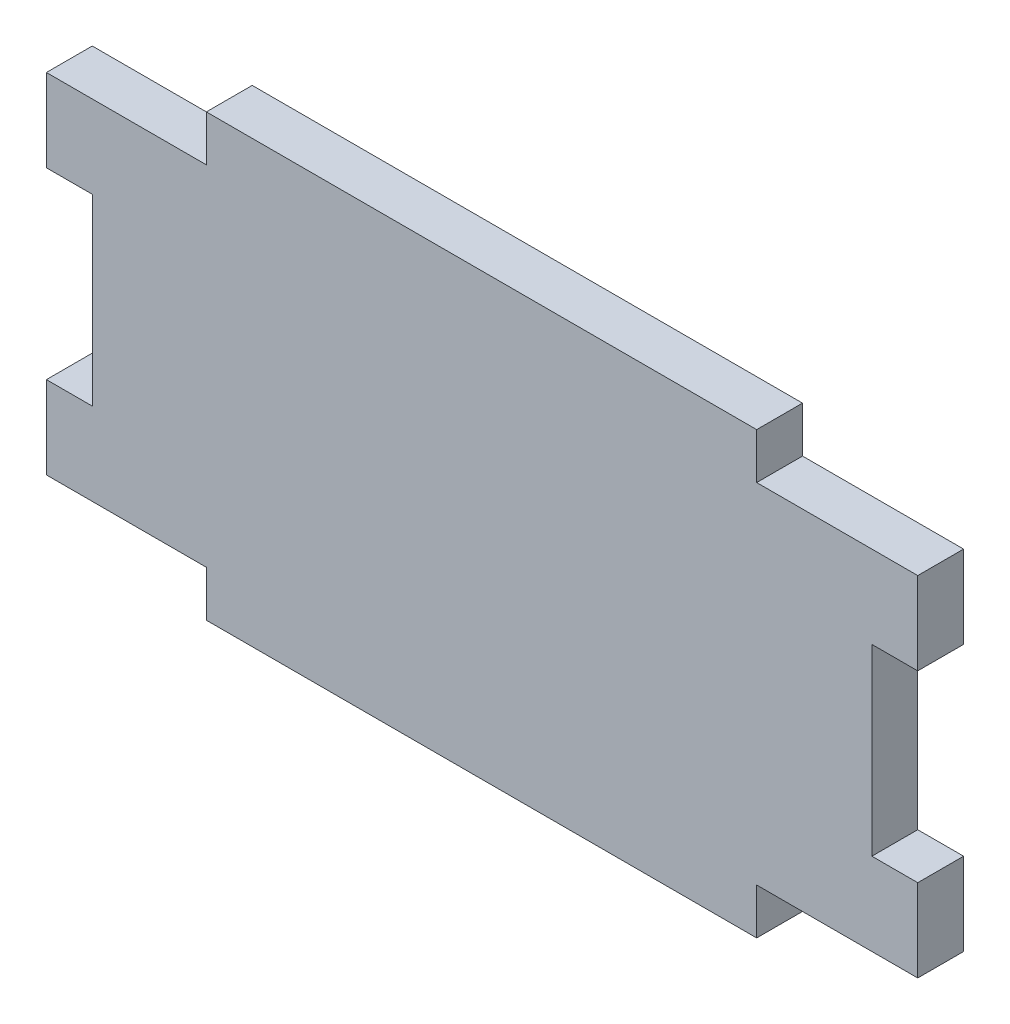
ISO-10303-21;
HEADER;
FILE_DESCRIPTION(('STEP AP214'),'2;1');
FILE_NAME('part.step','',(''),(''),'','','');
FILE_SCHEMA(('AUTOMOTIVE_DESIGN { 1 0 10303 214 1 1 1 1 }'));
ENDSEC;
DATA;
#1=APPLICATION_CONTEXT('core data for automotive mechanical design processes');
#2=APPLICATION_PROTOCOL_DEFINITION('international standard','automotive_design',2000,#1);
#3=PRODUCT_CONTEXT('',#1,'mechanical');
#4=PRODUCT('Part','Part','',(#3));
#5=PRODUCT_RELATED_PRODUCT_CATEGORY('part','',(#4));
#6=PRODUCT_DEFINITION_FORMATION('','',#4);
#7=PRODUCT_DEFINITION_CONTEXT('part definition',#1,'design');
#8=PRODUCT_DEFINITION('design','',#6,#7);
#9=PRODUCT_DEFINITION_SHAPE('','',#8);
#10=(LENGTH_UNIT() NAMED_UNIT(*) SI_UNIT(.MILLI.,.METRE.));
#11=(NAMED_UNIT(*) PLANE_ANGLE_UNIT() SI_UNIT($,.RADIAN.));
#12=(NAMED_UNIT(*) SI_UNIT($,.STERADIAN.) SOLID_ANGLE_UNIT());
#13=UNCERTAINTY_MEASURE_WITH_UNIT(LENGTH_MEASURE(1.E-05),#10,'distance_accuracy_value','');
#14=(GEOMETRIC_REPRESENTATION_CONTEXT(3) GLOBAL_UNCERTAINTY_ASSIGNED_CONTEXT((#13)) GLOBAL_UNIT_ASSIGNED_CONTEXT((#10,
#11,#12)) REPRESENTATION_CONTEXT('',''));
#15=CARTESIAN_POINT('',(0.,0.,0.));
#16=DIRECTION('',(0.,0.,1.));
#17=DIRECTION('',(1.,0.,0.));
#18=AXIS2_PLACEMENT_3D('',#15,#16,#17);
#19=CARTESIAN_POINT('',(-67.2746171850988,0.,5.));
#20=DIRECTION('',(1.,0.,0.));
#21=DIRECTION('',(0.,0.,-1.));
#22=AXIS2_PLACEMENT_3D('',#19,#20,#21);
#23=PLANE('',#22);
#24=DIRECTION('',(0.,-1.,0.));
#25=VECTOR('',#24,1.);
#26=CARTESIAN_POINT('',(-67.2746171850988,0.,0.));
#27=LINE('',#26,#25);
#28=CARTESIAN_POINT('',(-67.2746171850988,-84.2681131457359,0.));
#29=VERTEX_POINT('',#28);
#30=CARTESIAN_POINT('',(-67.2746171850988,-104.268113145736,0.));
#31=VERTEX_POINT('',#30);
#32=EDGE_CURVE('E199',#29,#31,#27,.T.);
#33=ORIENTED_EDGE('',*,*,#32,.F.);
#34=DIRECTION('',(0.,0.,-1.));
#35=VECTOR('',#34,1.);
#36=CARTESIAN_POINT('',(-67.2746171850988,-84.2681131457359,5.));
#37=LINE('',#36,#35);
#38=CARTESIAN_POINT('',(-67.2746171850988,-84.2681131457359,5.));
#39=VERTEX_POINT('',#38);
#40=EDGE_CURVE('E11',#39,#29,#37,.T.);
#41=ORIENTED_EDGE('',*,*,#40,.F.);
#42=DIRECTION('',(0.,-1.,0.));
#43=VECTOR('',#42,1.);
#44=CARTESIAN_POINT('',(-67.2746171850988,0.,5.));
#45=LINE('',#44,#43);
#46=CARTESIAN_POINT('',(-67.2746171850988,-104.268113145736,5.));
#47=VERTEX_POINT('',#46);
#48=EDGE_CURVE('E247',#39,#47,#45,.T.);
#49=ORIENTED_EDGE('',*,*,#48,.T.);
#50=DIRECTION('',(0.,0.,-1.));
#51=VECTOR('',#50,1.);
#52=CARTESIAN_POINT('',(-67.2746171850988,-104.268113145736,5.));
#53=LINE('',#52,#51);
#54=EDGE_CURVE('E119',#47,#31,#53,.T.);
#55=ORIENTED_EDGE('',*,*,#54,.T.);
#56=EDGE_LOOP('',(#33,#41,#49,#55));
#57=FACE_BOUND('',#56,.T.);
#58=ADVANCED_FACE('F33',(#57),#23,.T.);
#59=CARTESIAN_POINT('',(0.,-84.2681131457359,5.));
#60=DIRECTION('',(0.,-1.,0.));
#61=DIRECTION('',(0.,0.,-1.));
#62=AXIS2_PLACEMENT_3D('',#59,#60,#61);
#63=PLANE('',#62);
#64=DIRECTION('',(-1.,0.,0.));
#65=VECTOR('',#64,1.);
#66=CARTESIAN_POINT('',(0.,-84.2681131457359,0.));
#67=LINE('',#66,#65);
#68=CARTESIAN_POINT('',(-62.2746171850988,-84.2681131457359,0.));
#69=VERTEX_POINT('',#68);
#70=EDGE_CURVE('E202',#69,#29,#67,.T.);
#71=ORIENTED_EDGE('',*,*,#70,.F.);
#72=DIRECTION('',(0.,0.,-1.));
#73=VECTOR('',#72,1.);
#74=CARTESIAN_POINT('',(-62.2746171850988,-84.2681131457359,5.));
#75=LINE('',#74,#73);
#76=CARTESIAN_POINT('',(-62.2746171850988,-84.2681131457359,5.));
#77=VERTEX_POINT('',#76);
#78=EDGE_CURVE('E41',#77,#69,#75,.T.);
#79=ORIENTED_EDGE('',*,*,#78,.F.);
#80=DIRECTION('',(-1.,0.,0.));
#81=VECTOR('',#80,1.);
#82=CARTESIAN_POINT('',(0.,-84.2681131457359,5.));
#83=LINE('',#82,#81);
#84=EDGE_CURVE('E305',#77,#39,#83,.T.);
#85=ORIENTED_EDGE('',*,*,#84,.T.);
#86=ORIENTED_EDGE('',*,*,#40,.T.);
#87=EDGE_LOOP('',(#71,#79,#85,#86));
#88=FACE_BOUND('',#87,.T.);
#89=ADVANCED_FACE('F293',(#88),#63,.T.);
#90=CARTESIAN_POINT('',(-62.2746171850988,0.,5.));
#91=DIRECTION('',(1.,0.,0.));
#92=DIRECTION('',(0.,0.,-1.));
#93=AXIS2_PLACEMENT_3D('',#90,#91,#92);
#94=PLANE('',#93);
#95=DIRECTION('',(0.,-1.,0.));
#96=VECTOR('',#95,1.);
#97=CARTESIAN_POINT('',(-62.2746171850988,0.,0.));
#98=LINE('',#97,#96);
#99=CARTESIAN_POINT('',(-62.2746171850988,-75.2681131457359,0.));
#100=VERTEX_POINT('',#99);
#101=EDGE_CURVE('E205',#100,#69,#98,.T.);
#102=ORIENTED_EDGE('',*,*,#101,.F.);
#103=DIRECTION('',(0.,0.,-1.));
#104=VECTOR('',#103,1.);
#105=CARTESIAN_POINT('',(-62.2746171850988,-75.2681131457359,5.));
#106=LINE('',#105,#104);
#107=CARTESIAN_POINT('',(-62.2746171850988,-75.2681131457359,5.));
#108=VERTEX_POINT('',#107);
#109=EDGE_CURVE('E282',#108,#100,#106,.T.);
#110=ORIENTED_EDGE('',*,*,#109,.F.);
#111=DIRECTION('',(0.,-1.,0.));
#112=VECTOR('',#111,1.);
#113=CARTESIAN_POINT('',(-62.2746171850988,0.,5.));
#114=LINE('',#113,#112);
#115=EDGE_CURVE('E289',#108,#77,#114,.T.);
#116=ORIENTED_EDGE('',*,*,#115,.T.);
#117=ORIENTED_EDGE('',*,*,#78,.T.);
#118=EDGE_LOOP('',(#102,#110,#116,#117));
#119=FACE_BOUND('',#118,.T.);
#120=ADVANCED_FACE('F287',(#119),#94,.T.);
#121=CARTESIAN_POINT('',(0.,-75.2681131457359,5.));
#122=DIRECTION('',(0.,1.,0.));
#123=DIRECTION('',(0.,0.,1.));
#124=AXIS2_PLACEMENT_3D('',#121,#122,#123);
#125=PLANE('',#124);
#126=DIRECTION('',(1.,0.,0.));
#127=VECTOR('',#126,1.);
#128=CARTESIAN_POINT('',(0.,-75.2681131457359,0.));
#129=LINE('',#128,#127);
#130=CARTESIAN_POINT('',(-79.8357424721595,-75.2681131457359,0.));
#131=VERTEX_POINT('',#130);
#132=EDGE_CURVE('E208',#131,#100,#129,.T.);
#133=ORIENTED_EDGE('',*,*,#132,.F.);
#134=DIRECTION('',(0.,0.,-1.));
#135=VECTOR('',#134,1.);
#136=CARTESIAN_POINT('',(-79.8357424721595,-75.2681131457359,5.));
#137=LINE('',#136,#135);
#138=CARTESIAN_POINT('',(-79.8357424721595,-75.2681131457359,5.));
#139=VERTEX_POINT('',#138);
#140=EDGE_CURVE('E280',#139,#131,#137,.T.);
#141=ORIENTED_EDGE('',*,*,#140,.F.);
#142=DIRECTION('',(1.,0.,0.));
#143=VECTOR('',#142,1.);
#144=CARTESIAN_POINT('',(0.,-75.2681131457359,5.));
#145=LINE('',#144,#143);
#146=EDGE_CURVE('E302',#139,#108,#145,.T.);
#147=ORIENTED_EDGE('',*,*,#146,.T.);
#148=ORIENTED_EDGE('',*,*,#109,.T.);
#149=EDGE_LOOP('',(#133,#141,#147,#148));
#150=FACE_BOUND('',#149,.T.);
#151=ADVANCED_FACE('F299',(#150),#125,.T.);
#152=CARTESIAN_POINT('',(-79.8357424721595,0.,5.));
#153=DIRECTION('',(1.,0.,0.));
#154=DIRECTION('',(0.,0.,-1.));
#155=AXIS2_PLACEMENT_3D('',#152,#153,#154);
#156=PLANE('',#155);
#157=DIRECTION('',(0.,-1.,0.));
#158=VECTOR('',#157,1.);
#159=CARTESIAN_POINT('',(-79.8357424721595,0.,0.));
#160=LINE('',#159,#158);
#161=CARTESIAN_POINT('',(-79.8357424721595,-70.2681131457359,0.));
#162=VERTEX_POINT('',#161);
#163=EDGE_CURVE('E211',#162,#131,#160,.T.);
#164=ORIENTED_EDGE('',*,*,#163,.F.);
#165=DIRECTION('',(0.,0.,-1.));
#166=VECTOR('',#165,1.);
#167=CARTESIAN_POINT('',(-79.8357424721595,-70.2681131457359,5.));
#168=LINE('',#167,#166);
#169=CARTESIAN_POINT('',(-79.8357424721595,-70.2681131457359,5.));
#170=VERTEX_POINT('',#169);
#171=EDGE_CURVE('E278',#170,#162,#168,.T.);
#172=ORIENTED_EDGE('',*,*,#171,.F.);
#173=DIRECTION('',(0.,-1.,0.));
#174=VECTOR('',#173,1.);
#175=CARTESIAN_POINT('',(-79.8357424721595,0.,5.));
#176=LINE('',#175,#174);
#177=EDGE_CURVE('E307',#170,#139,#176,.T.);
#178=ORIENTED_EDGE('',*,*,#177,.T.);
#179=ORIENTED_EDGE('',*,*,#140,.T.);
#180=EDGE_LOOP('',(#164,#172,#178,#179));
#181=FACE_BOUND('',#180,.T.);
#182=ADVANCED_FACE('F348',(#181),#156,.T.);
#183=CARTESIAN_POINT('',(0.,-70.2681131457359,5.));
#184=DIRECTION('',(0.,1.,0.));
#185=DIRECTION('',(0.,0.,1.));
#186=AXIS2_PLACEMENT_3D('',#183,#184,#185);
#187=PLANE('',#186);
#188=DIRECTION('',(1.,0.,0.));
#189=VECTOR('',#188,1.);
#190=CARTESIAN_POINT('',(0.,-70.2681131457359,0.));
#191=LINE('',#190,#189);
#192=CARTESIAN_POINT('',(-139.835742472159,-70.2681131457359,0.));
#193=VERTEX_POINT('',#192);
#194=EDGE_CURVE('E215',#193,#162,#191,.T.);
#195=ORIENTED_EDGE('',*,*,#194,.F.);
#196=DIRECTION('',(0.,0.,-1.));
#197=VECTOR('',#196,1.);
#198=CARTESIAN_POINT('',(-139.835742472159,-70.2681131457359,5.));
#199=LINE('',#198,#197);
#200=CARTESIAN_POINT('',(-139.835742472159,-70.2681131457359,5.));
#201=VERTEX_POINT('',#200);
#202=EDGE_CURVE('E276',#201,#193,#199,.T.);
#203=ORIENTED_EDGE('',*,*,#202,.F.);
#204=DIRECTION('',(1.,0.,0.));
#205=VECTOR('',#204,1.);
#206=CARTESIAN_POINT('',(0.,-70.2681131457359,5.));
#207=LINE('',#206,#205);
#208=EDGE_CURVE('E314',#201,#170,#207,.T.);
#209=ORIENTED_EDGE('',*,*,#208,.T.);
#210=ORIENTED_EDGE('',*,*,#171,.T.);
#211=EDGE_LOOP('',(#195,#203,#209,#210));
#212=FACE_BOUND('',#211,.T.);
#213=ADVANCED_FACE('F351',(#212),#187,.T.);
#214=CARTESIAN_POINT('',(-139.835742472159,0.,5.));
#215=DIRECTION('',(1.,0.,0.));
#216=DIRECTION('',(0.,0.,-1.));
#217=AXIS2_PLACEMENT_3D('',#214,#215,#216);
#218=PLANE('',#217);
#219=DIRECTION('',(0.,-1.,0.));
#220=VECTOR('',#219,1.);
#221=CARTESIAN_POINT('',(-139.835742472159,0.,0.));
#222=LINE('',#221,#220);
#223=CARTESIAN_POINT('',(-139.835742472159,-75.2681131457359,0.));
#224=VERTEX_POINT('',#223);
#225=EDGE_CURVE('E218',#193,#224,#222,.T.);
#226=ORIENTED_EDGE('',*,*,#225,.T.);
#227=DIRECTION('',(0.,0.,-1.));
#228=VECTOR('',#227,1.);
#229=CARTESIAN_POINT('',(-139.835742472159,-75.2681131457359,5.));
#230=LINE('',#229,#228);
#231=CARTESIAN_POINT('',(-139.835742472159,-75.2681131457359,5.));
#232=VERTEX_POINT('',#231);
#233=EDGE_CURVE('E274',#232,#224,#230,.T.);
#234=ORIENTED_EDGE('',*,*,#233,.F.);
#235=DIRECTION('',(0.,-1.,0.));
#236=VECTOR('',#235,1.);
#237=CARTESIAN_POINT('',(-139.835742472159,0.,5.));
#238=LINE('',#237,#236);
#239=EDGE_CURVE('E317',#201,#232,#238,.T.);
#240=ORIENTED_EDGE('',*,*,#239,.F.);
#241=ORIENTED_EDGE('',*,*,#202,.T.);
#242=EDGE_LOOP('',(#226,#234,#240,#241));
#243=FACE_BOUND('',#242,.T.);
#244=ADVANCED_FACE('F355',(#243),#218,.F.);
#245=CARTESIAN_POINT('',(-157.274617185099,-75.2681131457359,0.));
#246=VERTEX_POINT('',#245);
#247=EDGE_CURVE('E212',#246,#224,#129,.T.);
#248=ORIENTED_EDGE('',*,*,#247,.F.);
#249=DIRECTION('',(0.,0.,-1.));
#250=VECTOR('',#249,1.);
#251=CARTESIAN_POINT('',(-157.274617185099,-75.2681131457359,5.));
#252=LINE('',#251,#250);
#253=CARTESIAN_POINT('',(-157.274617185099,-75.2681131457359,5.));
#254=VERTEX_POINT('',#253);
#255=EDGE_CURVE('E272',#254,#246,#252,.T.);
#256=ORIENTED_EDGE('',*,*,#255,.F.);
#257=EDGE_CURVE('E309',#254,#232,#145,.T.);
#258=ORIENTED_EDGE('',*,*,#257,.T.);
#259=ORIENTED_EDGE('',*,*,#233,.T.);
#260=EDGE_LOOP('',(#248,#256,#258,#259));
#261=FACE_BOUND('',#260,.T.);
#262=ADVANCED_FACE('F359',(#261),#125,.T.);
#263=CARTESIAN_POINT('',(-157.274617185099,0.,5.));
#264=DIRECTION('',(1.,0.,0.));
#265=DIRECTION('',(0.,0.,-1.));
#266=AXIS2_PLACEMENT_3D('',#263,#264,#265);
#267=PLANE('',#266);
#268=DIRECTION('',(0.,-1.,0.));
#269=VECTOR('',#268,1.);
#270=CARTESIAN_POINT('',(-157.274617185099,0.,0.));
#271=LINE('',#270,#269);
#272=CARTESIAN_POINT('',(-157.274617185099,-84.2681131457359,0.));
#273=VERTEX_POINT('',#272);
#274=EDGE_CURVE('E221',#246,#273,#271,.T.);
#275=ORIENTED_EDGE('',*,*,#274,.T.);
#276=DIRECTION('',(0.,0.,-1.));
#277=VECTOR('',#276,1.);
#278=CARTESIAN_POINT('',(-157.274617185099,-84.2681131457359,5.));
#279=LINE('',#278,#277);
#280=CARTESIAN_POINT('',(-157.274617185099,-84.2681131457359,5.));
#281=VERTEX_POINT('',#280);
#282=EDGE_CURVE('E270',#281,#273,#279,.T.);
#283=ORIENTED_EDGE('',*,*,#282,.F.);
#284=DIRECTION('',(0.,-1.,0.));
#285=VECTOR('',#284,1.);
#286=CARTESIAN_POINT('',(-157.274617185099,0.,5.));
#287=LINE('',#286,#285);
#288=EDGE_CURVE('E319',#254,#281,#287,.T.);
#289=ORIENTED_EDGE('',*,*,#288,.F.);
#290=ORIENTED_EDGE('',*,*,#255,.T.);
#291=EDGE_LOOP('',(#275,#283,#289,#290));
#292=FACE_BOUND('',#291,.T.);
#293=ADVANCED_FACE('F363',(#292),#267,.F.);
#294=CARTESIAN_POINT('',(0.,-84.2681131457359,5.));
#295=DIRECTION('',(0.,-1.,0.));
#296=DIRECTION('',(0.,0.,-1.));
#297=AXIS2_PLACEMENT_3D('',#294,#295,#296);
#298=PLANE('',#297);
#299=DIRECTION('',(-1.,0.,0.));
#300=VECTOR('',#299,1.);
#301=CARTESIAN_POINT('',(0.,-84.2681131457359,0.));
#302=LINE('',#301,#300);
#303=CARTESIAN_POINT('',(-152.274617185099,-84.2681131457359,0.));
#304=VERTEX_POINT('',#303);
#305=EDGE_CURVE('E224',#304,#273,#302,.T.);
#306=ORIENTED_EDGE('',*,*,#305,.F.);
#307=DIRECTION('',(0.,0.,-1.));
#308=VECTOR('',#307,1.);
#309=CARTESIAN_POINT('',(-152.274617185099,-84.2681131457359,5.));
#310=LINE('',#309,#308);
#311=CARTESIAN_POINT('',(-152.274617185099,-84.2681131457359,5.));
#312=VERTEX_POINT('',#311);
#313=EDGE_CURVE('E268',#312,#304,#310,.T.);
#314=ORIENTED_EDGE('',*,*,#313,.F.);
#315=DIRECTION('',(-1.,0.,0.));
#316=VECTOR('',#315,1.);
#317=CARTESIAN_POINT('',(0.,-84.2681131457359,5.));
#318=LINE('',#317,#316);
#319=EDGE_CURVE('E321',#312,#281,#318,.T.);
#320=ORIENTED_EDGE('',*,*,#319,.T.);
#321=ORIENTED_EDGE('',*,*,#282,.T.);
#322=EDGE_LOOP('',(#306,#314,#320,#321));
#323=FACE_BOUND('',#322,.T.);
#324=ADVANCED_FACE('F367',(#323),#298,.T.);
#325=CARTESIAN_POINT('',(-152.274617185099,0.,5.));
#326=DIRECTION('',(1.,0.,0.));
#327=DIRECTION('',(0.,0.,-1.));
#328=AXIS2_PLACEMENT_3D('',#325,#326,#327);
#329=PLANE('',#328);
#330=DIRECTION('',(0.,-1.,0.));
#331=VECTOR('',#330,1.);
#332=CARTESIAN_POINT('',(-152.274617185099,0.,0.));
#333=LINE('',#332,#331);
#334=CARTESIAN_POINT('',(-152.274617185099,-104.268113145736,0.));
#335=VERTEX_POINT('',#334);
#336=EDGE_CURVE('E227',#304,#335,#333,.T.);
#337=ORIENTED_EDGE('',*,*,#336,.T.);
#338=DIRECTION('',(0.,0.,-1.));
#339=VECTOR('',#338,1.);
#340=CARTESIAN_POINT('',(-152.274617185099,-104.268113145736,5.));
#341=LINE('',#340,#339);
#342=CARTESIAN_POINT('',(-152.274617185099,-104.268113145736,5.));
#343=VERTEX_POINT('',#342);
#344=EDGE_CURVE('E265',#343,#335,#341,.T.);
#345=ORIENTED_EDGE('',*,*,#344,.F.);
#346=DIRECTION('',(0.,-1.,0.));
#347=VECTOR('',#346,1.);
#348=CARTESIAN_POINT('',(-152.274617185099,0.,5.));
#349=LINE('',#348,#347);
#350=EDGE_CURVE('E324',#312,#343,#349,.T.);
#351=ORIENTED_EDGE('',*,*,#350,.F.);
#352=ORIENTED_EDGE('',*,*,#313,.T.);
#353=EDGE_LOOP('',(#337,#345,#351,#352));
#354=FACE_BOUND('',#353,.T.);
#355=ADVANCED_FACE('F371',(#354),#329,.F.);
#356=CARTESIAN_POINT('',(0.,-104.268113145736,5.));
#357=DIRECTION('',(0.,-1.,0.));
#358=DIRECTION('',(0.,0.,-1.));
#359=AXIS2_PLACEMENT_3D('',#356,#357,#358);
#360=PLANE('',#359);
#361=DIRECTION('',(-1.,0.,0.));
#362=VECTOR('',#361,1.);
#363=CARTESIAN_POINT('',(0.,-104.268113145736,0.));
#364=LINE('',#363,#362);
#365=CARTESIAN_POINT('',(-157.274617185099,-104.268113145736,0.));
#366=VERTEX_POINT('',#365);
#367=EDGE_CURVE('E229',#335,#366,#364,.T.);
#368=ORIENTED_EDGE('',*,*,#367,.T.);
#369=DIRECTION('',(0.,0.,-1.));
#370=VECTOR('',#369,1.);
#371=CARTESIAN_POINT('',(-157.274617185099,-104.268113145736,5.));
#372=LINE('',#371,#370);
#373=CARTESIAN_POINT('',(-157.274617185099,-104.268113145736,5.));
#374=VERTEX_POINT('',#373);
#375=EDGE_CURVE('E262',#374,#366,#372,.T.);
#376=ORIENTED_EDGE('',*,*,#375,.F.);
#377=DIRECTION('',(-1.,0.,0.));
#378=VECTOR('',#377,1.);
#379=CARTESIAN_POINT('',(0.,-104.268113145736,5.));
#380=LINE('',#379,#378);
#381=EDGE_CURVE('E326',#343,#374,#380,.T.);
#382=ORIENTED_EDGE('',*,*,#381,.F.);
#383=ORIENTED_EDGE('',*,*,#344,.T.);
#384=EDGE_LOOP('',(#368,#376,#382,#383));
#385=FACE_BOUND('',#384,.T.);
#386=ADVANCED_FACE('F375',(#385),#360,.F.);
#387=CARTESIAN_POINT('',(-157.274617185099,0.,5.));
#388=DIRECTION('',(1.,0.,0.));
#389=DIRECTION('',(0.,0.,-1.));
#390=AXIS2_PLACEMENT_3D('',#387,#388,#389);
#391=PLANE('',#390);
#392=DIRECTION('',(0.,-1.,0.));
#393=VECTOR('',#392,1.);
#394=CARTESIAN_POINT('',(-157.274617185099,0.,0.));
#395=LINE('',#394,#393);
#396=CARTESIAN_POINT('',(-157.274617185099,-113.268113145736,0.));
#397=VERTEX_POINT('',#396);
#398=EDGE_CURVE('E231',#366,#397,#395,.T.);
#399=ORIENTED_EDGE('',*,*,#398,.T.);
#400=DIRECTION('',(0.,0.,-1.));
#401=VECTOR('',#400,1.);
#402=CARTESIAN_POINT('',(-157.274617185099,-113.268113145736,5.));
#403=LINE('',#402,#401);
#404=CARTESIAN_POINT('',(-157.274617185099,-113.268113145736,5.));
#405=VERTEX_POINT('',#404);
#406=EDGE_CURVE('E259',#405,#397,#403,.T.);
#407=ORIENTED_EDGE('',*,*,#406,.F.);
#408=DIRECTION('',(0.,-1.,0.));
#409=VECTOR('',#408,1.);
#410=CARTESIAN_POINT('',(-157.274617185099,0.,5.));
#411=LINE('',#410,#409);
#412=EDGE_CURVE('E328',#374,#405,#411,.T.);
#413=ORIENTED_EDGE('',*,*,#412,.F.);
#414=ORIENTED_EDGE('',*,*,#375,.T.);
#415=EDGE_LOOP('',(#399,#407,#413,#414));
#416=FACE_BOUND('',#415,.T.);
#417=ADVANCED_FACE('F379',(#416),#391,.F.);
#418=CARTESIAN_POINT('',(0.,-113.268113145736,5.));
#419=DIRECTION('',(0.,1.,0.));
#420=DIRECTION('',(0.,0.,1.));
#421=AXIS2_PLACEMENT_3D('',#418,#419,#420);
#422=PLANE('',#421);
#423=DIRECTION('',(1.,0.,0.));
#424=VECTOR('',#423,1.);
#425=CARTESIAN_POINT('',(0.,-113.268113145736,0.));
#426=LINE('',#425,#424);
#427=CARTESIAN_POINT('',(-139.835742472159,-113.268113145736,0.));
#428=VERTEX_POINT('',#427);
#429=EDGE_CURVE('E233',#397,#428,#426,.T.);
#430=ORIENTED_EDGE('',*,*,#429,.T.);
#431=DIRECTION('',(0.,0.,-1.));
#432=VECTOR('',#431,1.);
#433=CARTESIAN_POINT('',(-139.835742472159,-113.268113145736,5.));
#434=LINE('',#433,#432);
#435=CARTESIAN_POINT('',(-139.835742472159,-113.268113145736,5.));
#436=VERTEX_POINT('',#435);
#437=EDGE_CURVE('E256',#436,#428,#434,.T.);
#438=ORIENTED_EDGE('',*,*,#437,.F.);
#439=DIRECTION('',(1.,0.,0.));
#440=VECTOR('',#439,1.);
#441=CARTESIAN_POINT('',(0.,-113.268113145736,5.));
#442=LINE('',#441,#440);
#443=EDGE_CURVE('E182',#405,#436,#442,.T.);
#444=ORIENTED_EDGE('',*,*,#443,.F.);
#445=ORIENTED_EDGE('',*,*,#406,.T.);
#446=EDGE_LOOP('',(#430,#438,#444,#445));
#447=FACE_BOUND('',#446,.T.);
#448=ADVANCED_FACE('F383',(#447),#422,.F.);
#449=CARTESIAN_POINT('',(-139.835742472159,0.,5.));
#450=DIRECTION('',(1.,0.,0.));
#451=DIRECTION('',(0.,0.,-1.));
#452=AXIS2_PLACEMENT_3D('',#449,#450,#451);
#453=PLANE('',#452);
#454=DIRECTION('',(0.,-1.,0.));
#455=VECTOR('',#454,1.);
#456=CARTESIAN_POINT('',(-139.835742472159,0.,0.));
#457=LINE('',#456,#455);
#458=CARTESIAN_POINT('',(-139.835742472159,-118.268113145736,0.));
#459=VERTEX_POINT('',#458);
#460=EDGE_CURVE('E235',#428,#459,#457,.T.);
#461=ORIENTED_EDGE('',*,*,#460,.T.);
#462=DIRECTION('',(0.,0.,-1.));
#463=VECTOR('',#462,1.);
#464=CARTESIAN_POINT('',(-139.835742472159,-118.268113145736,5.));
#465=LINE('',#464,#463);
#466=CARTESIAN_POINT('',(-139.835742472159,-118.268113145736,5.));
#467=VERTEX_POINT('',#466);
#468=EDGE_CURVE('E253',#467,#459,#465,.T.);
#469=ORIENTED_EDGE('',*,*,#468,.F.);
#470=DIRECTION('',(0.,-1.,0.));
#471=VECTOR('',#470,1.);
#472=CARTESIAN_POINT('',(-139.835742472159,0.,5.));
#473=LINE('',#472,#471);
#474=EDGE_CURVE('E330',#436,#467,#473,.T.);
#475=ORIENTED_EDGE('',*,*,#474,.F.);
#476=ORIENTED_EDGE('',*,*,#437,.T.);
#477=EDGE_LOOP('',(#461,#469,#475,#476));
#478=FACE_BOUND('',#477,.T.);
#479=ADVANCED_FACE('F385',(#478),#453,.F.);
#480=CARTESIAN_POINT('',(0.,-118.268113145736,5.));
#481=DIRECTION('',(0.,1.,0.));
#482=DIRECTION('',(0.,0.,1.));
#483=AXIS2_PLACEMENT_3D('',#480,#481,#482);
#484=PLANE('',#483);
#485=DIRECTION('',(1.,0.,0.));
#486=VECTOR('',#485,1.);
#487=CARTESIAN_POINT('',(0.,-118.268113145736,0.));
#488=LINE('',#487,#486);
#489=CARTESIAN_POINT('',(-79.8357424721595,-118.268113145736,0.));
#490=VERTEX_POINT('',#489);
#491=EDGE_CURVE('E237',#459,#490,#488,.T.);
#492=ORIENTED_EDGE('',*,*,#491,.T.);
#493=DIRECTION('',(0.,0.,-1.));
#494=VECTOR('',#493,1.);
#495=CARTESIAN_POINT('',(-79.8357424721595,-118.268113145736,5.));
#496=LINE('',#495,#494);
#497=CARTESIAN_POINT('',(-79.8357424721595,-118.268113145736,5.));
#498=VERTEX_POINT('',#497);
#499=EDGE_CURVE('E251',#498,#490,#496,.T.);
#500=ORIENTED_EDGE('',*,*,#499,.F.);
#501=DIRECTION('',(1.,0.,0.));
#502=VECTOR('',#501,1.);
#503=CARTESIAN_POINT('',(0.,-118.268113145736,5.));
#504=LINE('',#503,#502);
#505=EDGE_CURVE('E331',#467,#498,#504,.T.);
#506=ORIENTED_EDGE('',*,*,#505,.F.);
#507=ORIENTED_EDGE('',*,*,#468,.T.);
#508=EDGE_LOOP('',(#492,#500,#506,#507));
#509=FACE_BOUND('',#508,.T.);
#510=ADVANCED_FACE('F388',(#509),#484,.F.);
#511=CARTESIAN_POINT('',(-79.8357424721595,0.,5.));
#512=DIRECTION('',(1.,0.,0.));
#513=DIRECTION('',(0.,0.,-1.));
#514=AXIS2_PLACEMENT_3D('',#511,#512,#513);
#515=PLANE('',#514);
#516=DIRECTION('',(0.,-1.,0.));
#517=VECTOR('',#516,1.);
#518=CARTESIAN_POINT('',(-79.8357424721595,0.,0.));
#519=LINE('',#518,#517);
#520=CARTESIAN_POINT('',(-79.8357424721595,-113.268113145736,0.));
#521=VERTEX_POINT('',#520);
#522=EDGE_CURVE('E240',#521,#490,#519,.T.);
#523=ORIENTED_EDGE('',*,*,#522,.F.);
#524=DIRECTION('',(0.,0.,-1.));
#525=VECTOR('',#524,1.);
#526=CARTESIAN_POINT('',(-79.8357424721595,-113.268113145736,5.));
#527=LINE('',#526,#525);
#528=CARTESIAN_POINT('',(-79.8357424721595,-113.268113145736,5.));
#529=VERTEX_POINT('',#528);
#530=EDGE_CURVE('E191',#529,#521,#527,.T.);
#531=ORIENTED_EDGE('',*,*,#530,.F.);
#532=DIRECTION('',(0.,-1.,0.));
#533=VECTOR('',#532,1.);
#534=CARTESIAN_POINT('',(-79.8357424721595,0.,5.));
#535=LINE('',#534,#533);
#536=EDGE_CURVE('E179',#529,#498,#535,.T.);
#537=ORIENTED_EDGE('',*,*,#536,.T.);
#538=ORIENTED_EDGE('',*,*,#499,.T.);
#539=EDGE_LOOP('',(#523,#531,#537,#538));
#540=FACE_BOUND('',#539,.T.);
#541=ADVANCED_FACE('F336',(#540),#515,.T.);
#542=CARTESIAN_POINT('',(-62.2746171850988,-113.268113145736,0.));
#543=VERTEX_POINT('',#542);
#544=EDGE_CURVE('E187',#521,#543,#426,.T.);
#545=ORIENTED_EDGE('',*,*,#544,.T.);
#546=DIRECTION('',(0.,0.,-1.));
#547=VECTOR('',#546,1.);
#548=CARTESIAN_POINT('',(-62.2746171850988,-113.268113145736,5.));
#549=LINE('',#548,#547);
#550=CARTESIAN_POINT('',(-62.2746171850988,-113.268113145736,5.));
#551=VERTEX_POINT('',#550);
#552=EDGE_CURVE('E184',#551,#543,#549,.T.);
#553=ORIENTED_EDGE('',*,*,#552,.F.);
#554=EDGE_CURVE('E173',#529,#551,#442,.T.);
#555=ORIENTED_EDGE('',*,*,#554,.F.);
#556=ORIENTED_EDGE('',*,*,#530,.T.);
#557=EDGE_LOOP('',(#545,#553,#555,#556));
#558=FACE_BOUND('',#557,.T.);
#559=ADVANCED_FACE('F185',(#558),#422,.F.);
#560=CARTESIAN_POINT('',(-62.2746171850988,0.,5.));
#561=DIRECTION('',(1.,0.,0.));
#562=DIRECTION('',(0.,0.,-1.));
#563=AXIS2_PLACEMENT_3D('',#560,#561,#562);
#564=PLANE('',#563);
#565=DIRECTION('',(0.,-1.,0.));
#566=VECTOR('',#565,1.);
#567=CARTESIAN_POINT('',(-62.2746171850988,0.,0.));
#568=LINE('',#567,#566);
#569=CARTESIAN_POINT('',(-62.2746171850988,-104.268113145736,0.));
#570=VERTEX_POINT('',#569);
#571=EDGE_CURVE('E243',#570,#543,#568,.T.);
#572=ORIENTED_EDGE('',*,*,#571,.F.);
#573=DIRECTION('',(0.,0.,-1.));
#574=VECTOR('',#573,1.);
#575=CARTESIAN_POINT('',(-62.2746171850988,-104.268113145736,5.));
#576=LINE('',#575,#574);
#577=CARTESIAN_POINT('',(-62.2746171850988,-104.268113145736,5.));
#578=VERTEX_POINT('',#577);
#579=EDGE_CURVE('E112',#578,#570,#576,.T.);
#580=ORIENTED_EDGE('',*,*,#579,.F.);
#581=DIRECTION('',(0.,-1.,0.));
#582=VECTOR('',#581,1.);
#583=CARTESIAN_POINT('',(-62.2746171850988,0.,5.));
#584=LINE('',#583,#582);
#585=EDGE_CURVE('E177',#578,#551,#584,.T.);
#586=ORIENTED_EDGE('',*,*,#585,.T.);
#587=ORIENTED_EDGE('',*,*,#552,.T.);
#588=EDGE_LOOP('',(#572,#580,#586,#587));
#589=FACE_BOUND('',#588,.T.);
#590=ADVANCED_FACE('F193',(#589),#564,.T.);
#591=CARTESIAN_POINT('',(0.,-104.268113145736,5.));
#592=DIRECTION('',(0.,-1.,0.));
#593=DIRECTION('',(0.,0.,-1.));
#594=AXIS2_PLACEMENT_3D('',#591,#592,#593);
#595=PLANE('',#594);
#596=DIRECTION('',(-1.,0.,0.));
#597=VECTOR('',#596,1.);
#598=CARTESIAN_POINT('',(0.,-104.268113145736,0.));
#599=LINE('',#598,#597);
#600=EDGE_CURVE('E245',#570,#31,#599,.T.);
#601=ORIENTED_EDGE('',*,*,#600,.T.);
#602=ORIENTED_EDGE('',*,*,#54,.F.);
#603=DIRECTION('',(-1.,0.,0.));
#604=VECTOR('',#603,1.);
#605=CARTESIAN_POINT('',(0.,-104.268113145736,5.));
#606=LINE('',#605,#604);
#607=EDGE_CURVE('E49',#578,#47,#606,.T.);
#608=ORIENTED_EDGE('',*,*,#607,.F.);
#609=ORIENTED_EDGE('',*,*,#579,.T.);
#610=EDGE_LOOP('',(#601,#602,#608,#609));
#611=FACE_BOUND('',#610,.T.);
#612=ADVANCED_FACE('F338',(#611),#595,.F.);
#613=CARTESIAN_POINT('',(0.,0.,5.));
#614=DIRECTION('',(0.,0.,1.));
#615=DIRECTION('',(1.,0.,0.));
#616=AXIS2_PLACEMENT_3D('',#613,#614,#615);
#617=PLANE('',#616);
#618=ORIENTED_EDGE('',*,*,#48,.F.);
#619=ORIENTED_EDGE('',*,*,#84,.F.);
#620=ORIENTED_EDGE('',*,*,#115,.F.);
#621=ORIENTED_EDGE('',*,*,#146,.F.);
#622=ORIENTED_EDGE('',*,*,#177,.F.);
#623=ORIENTED_EDGE('',*,*,#208,.F.);
#624=ORIENTED_EDGE('',*,*,#239,.T.);
#625=ORIENTED_EDGE('',*,*,#257,.F.);
#626=ORIENTED_EDGE('',*,*,#288,.T.);
#627=ORIENTED_EDGE('',*,*,#319,.F.);
#628=ORIENTED_EDGE('',*,*,#350,.T.);
#629=ORIENTED_EDGE('',*,*,#381,.T.);
#630=ORIENTED_EDGE('',*,*,#412,.T.);
#631=ORIENTED_EDGE('',*,*,#443,.T.);
#632=ORIENTED_EDGE('',*,*,#474,.T.);
#633=ORIENTED_EDGE('',*,*,#505,.T.);
#634=ORIENTED_EDGE('',*,*,#536,.F.);
#635=ORIENTED_EDGE('',*,*,#554,.T.);
#636=ORIENTED_EDGE('',*,*,#585,.F.);
#637=ORIENTED_EDGE('',*,*,#607,.T.);
#638=EDGE_LOOP('',(#618,#619,#620,#621,#622,#623,#624,#625,#626,#627,#628,#629,#630,#631,#632,
#633,#634,#635,#636,#637));
#639=FACE_BOUND('',#638,.T.);
#640=ADVANCED_FACE('F175',(#639),#617,.T.);
#641=CARTESIAN_POINT('',(0.,0.,0.));
#642=DIRECTION('',(0.,0.,1.));
#643=DIRECTION('',(1.,0.,0.));
#644=AXIS2_PLACEMENT_3D('',#641,#642,#643);
#645=PLANE('',#644);
#646=ORIENTED_EDGE('',*,*,#32,.T.);
#647=ORIENTED_EDGE('',*,*,#600,.F.);
#648=ORIENTED_EDGE('',*,*,#571,.T.);
#649=ORIENTED_EDGE('',*,*,#544,.F.);
#650=ORIENTED_EDGE('',*,*,#522,.T.);
#651=ORIENTED_EDGE('',*,*,#491,.F.);
#652=ORIENTED_EDGE('',*,*,#460,.F.);
#653=ORIENTED_EDGE('',*,*,#429,.F.);
#654=ORIENTED_EDGE('',*,*,#398,.F.);
#655=ORIENTED_EDGE('',*,*,#367,.F.);
#656=ORIENTED_EDGE('',*,*,#336,.F.);
#657=ORIENTED_EDGE('',*,*,#305,.T.);
#658=ORIENTED_EDGE('',*,*,#274,.F.);
#659=ORIENTED_EDGE('',*,*,#247,.T.);
#660=ORIENTED_EDGE('',*,*,#225,.F.);
#661=ORIENTED_EDGE('',*,*,#194,.T.);
#662=ORIENTED_EDGE('',*,*,#163,.T.);
#663=ORIENTED_EDGE('',*,*,#132,.T.);
#664=ORIENTED_EDGE('',*,*,#101,.T.);
#665=ORIENTED_EDGE('',*,*,#70,.T.);
#666=EDGE_LOOP('',(#646,#647,#648,#649,#650,#651,#652,#653,#654,#655,#656,#657,#658,#659,#660,
#661,#662,#663,#664,#665));
#667=FACE_BOUND('',#666,.T.);
#668=ADVANCED_FACE('F295',(#667),#645,.F.);
#669=CLOSED_SHELL('',(#58,#89,#120,#151,#182,#213,#244,#262,#293,#324,#355,#386,#417,#448,#479,
#510,#541,#559,#590,#612,#640,#668));
#670=MANIFOLD_SOLID_BREP('B2',#669);
#671=ADVANCED_BREP_SHAPE_REPRESENTATION('',(#18,#670),#14);
#672=SHAPE_DEFINITION_REPRESENTATION(#9,#671);
ENDSEC;
END-ISO-10303-21;
